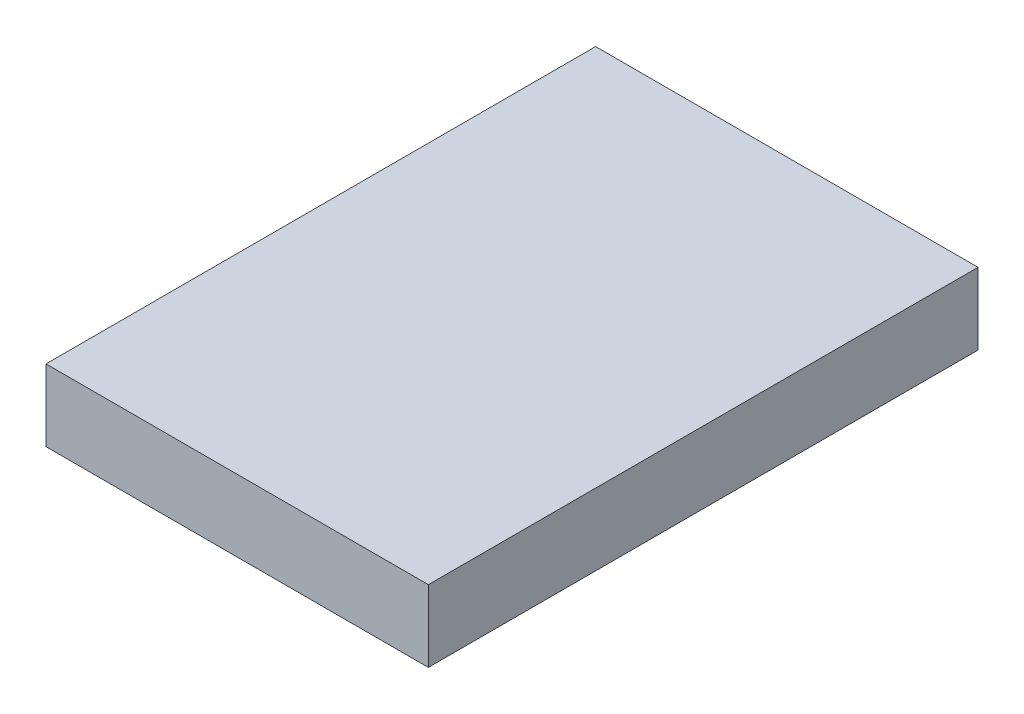
ISO-10303-21;
HEADER;
FILE_DESCRIPTION(('STEP AP214'),'2;1');
FILE_NAME('part.step','',(''),(''),'','','');
FILE_SCHEMA(('AUTOMOTIVE_DESIGN { 1 0 10303 214 1 1 1 1 }'));
ENDSEC;
DATA;
#1=APPLICATION_CONTEXT('core data for automotive mechanical design processes');
#2=APPLICATION_PROTOCOL_DEFINITION('international standard','automotive_design',2000,#1);
#3=PRODUCT_CONTEXT('',#1,'mechanical');
#4=PRODUCT('Part','Part','',(#3));
#5=PRODUCT_RELATED_PRODUCT_CATEGORY('part','',(#4));
#6=PRODUCT_DEFINITION_FORMATION('','',#4);
#7=PRODUCT_DEFINITION_CONTEXT('part definition',#1,'design');
#8=PRODUCT_DEFINITION('design','',#6,#7);
#9=PRODUCT_DEFINITION_SHAPE('','',#8);
#10=(LENGTH_UNIT() NAMED_UNIT(*) SI_UNIT(.MILLI.,.METRE.));
#11=(NAMED_UNIT(*) PLANE_ANGLE_UNIT() SI_UNIT($,.RADIAN.));
#12=(NAMED_UNIT(*) SI_UNIT($,.STERADIAN.) SOLID_ANGLE_UNIT());
#13=UNCERTAINTY_MEASURE_WITH_UNIT(LENGTH_MEASURE(1.E-05),#10,'distance_accuracy_value','');
#14=(GEOMETRIC_REPRESENTATION_CONTEXT(3) GLOBAL_UNCERTAINTY_ASSIGNED_CONTEXT((#13)) GLOBAL_UNIT_ASSIGNED_CONTEXT((#10,
#11,#12)) REPRESENTATION_CONTEXT('',''));
#15=CARTESIAN_POINT('',(0.,0.,0.));
#16=DIRECTION('',(0.,0.,1.));
#17=DIRECTION('',(1.,0.,0.));
#18=AXIS2_PLACEMENT_3D('',#15,#16,#17);
#19=CARTESIAN_POINT('',(0.,19.05,0.));
#20=DIRECTION('',(1.,0.,0.));
#21=DIRECTION('',(0.,0.,-1.));
#22=AXIS2_PLACEMENT_3D('',#19,#20,#21);
#23=PLANE('',#22);
#24=DIRECTION('',(0.,0.,1.));
#25=VECTOR('',#24,1.);
#26=CARTESIAN_POINT('',(0.,0.,0.));
#27=LINE('',#26,#25);
#28=CARTESIAN_POINT('',(0.,0.,-146.05));
#29=VERTEX_POINT('',#28);
#30=CARTESIAN_POINT('',(0.,0.,0.));
#31=VERTEX_POINT('',#30);
#32=EDGE_CURVE('E105',#29,#31,#27,.T.);
#33=ORIENTED_EDGE('',*,*,#32,.T.);
#34=DIRECTION('',(0.,-1.,0.));
#35=VECTOR('',#34,1.);
#36=CARTESIAN_POINT('',(0.,19.05,0.));
#37=LINE('',#36,#35);
#38=CARTESIAN_POINT('',(0.,19.05,0.));
#39=VERTEX_POINT('',#38);
#40=EDGE_CURVE('E11',#39,#31,#37,.T.);
#41=ORIENTED_EDGE('',*,*,#40,.F.);
#42=DIRECTION('',(0.,0.,1.));
#43=VECTOR('',#42,1.);
#44=CARTESIAN_POINT('',(0.,19.05,0.));
#45=LINE('',#44,#43);
#46=CARTESIAN_POINT('',(0.,19.05,-146.05));
#47=VERTEX_POINT('',#46);
#48=EDGE_CURVE('E89',#47,#39,#45,.T.);
#49=ORIENTED_EDGE('',*,*,#48,.F.);
#50=DIRECTION('',(0.,-1.,0.));
#51=VECTOR('',#50,1.);
#52=CARTESIAN_POINT('',(0.,19.05,-146.05));
#53=LINE('',#52,#51);
#54=EDGE_CURVE('E97',#47,#29,#53,.T.);
#55=ORIENTED_EDGE('',*,*,#54,.T.);
#56=EDGE_LOOP('',(#33,#41,#49,#55));
#57=FACE_BOUND('',#56,.T.);
#58=ADVANCED_FACE('F39',(#57),#23,.F.);
#59=CARTESIAN_POINT('',(0.,19.05,0.));
#60=DIRECTION('',(0.,0.,-1.));
#61=DIRECTION('',(-1.,0.,0.));
#62=AXIS2_PLACEMENT_3D('',#59,#60,#61);
#63=PLANE('',#62);
#64=DIRECTION('',(1.,0.,0.));
#65=VECTOR('',#64,1.);
#66=CARTESIAN_POINT('',(0.,0.,0.));
#67=LINE('',#66,#65);
#68=CARTESIAN_POINT('',(101.6,0.,0.));
#69=VERTEX_POINT('',#68);
#70=EDGE_CURVE('E92',#31,#69,#67,.T.);
#71=ORIENTED_EDGE('',*,*,#70,.T.);
#72=DIRECTION('',(0.,-1.,0.));
#73=VECTOR('',#72,1.);
#74=CARTESIAN_POINT('',(101.6,19.05,0.));
#75=LINE('',#74,#73);
#76=CARTESIAN_POINT('',(101.6,19.05,0.));
#77=VERTEX_POINT('',#76);
#78=EDGE_CURVE('E50',#77,#69,#75,.T.);
#79=ORIENTED_EDGE('',*,*,#78,.F.);
#80=DIRECTION('',(1.,0.,0.));
#81=VECTOR('',#80,1.);
#82=CARTESIAN_POINT('',(0.,19.05,0.));
#83=LINE('',#82,#81);
#84=EDGE_CURVE('E82',#39,#77,#83,.T.);
#85=ORIENTED_EDGE('',*,*,#84,.F.);
#86=ORIENTED_EDGE('',*,*,#40,.T.);
#87=EDGE_LOOP('',(#71,#79,#85,#86));
#88=FACE_BOUND('',#87,.T.);
#89=ADVANCED_FACE('F93',(#88),#63,.F.);
#90=CARTESIAN_POINT('',(101.6,19.05,0.));
#91=DIRECTION('',(-1.,0.,0.));
#92=DIRECTION('',(0.,0.,1.));
#93=AXIS2_PLACEMENT_3D('',#90,#91,#92);
#94=PLANE('',#93);
#95=DIRECTION('',(0.,0.,-1.));
#96=VECTOR('',#95,1.);
#97=CARTESIAN_POINT('',(101.6,0.,0.));
#98=LINE('',#97,#96);
#99=CARTESIAN_POINT('',(101.6,0.,-146.05));
#100=VERTEX_POINT('',#99);
#101=EDGE_CURVE('E72',#69,#100,#98,.T.);
#102=ORIENTED_EDGE('',*,*,#101,.T.);
#103=DIRECTION('',(0.,-1.,0.));
#104=VECTOR('',#103,1.);
#105=CARTESIAN_POINT('',(101.6,19.05,-146.05));
#106=LINE('',#105,#104);
#107=CARTESIAN_POINT('',(101.6,19.05,-146.05));
#108=VERTEX_POINT('',#107);
#109=EDGE_CURVE('E94',#108,#100,#106,.T.);
#110=ORIENTED_EDGE('',*,*,#109,.F.);
#111=DIRECTION('',(0.,0.,-1.));
#112=VECTOR('',#111,1.);
#113=CARTESIAN_POINT('',(101.6,19.05,0.));
#114=LINE('',#113,#112);
#115=EDGE_CURVE('E88',#77,#108,#114,.T.);
#116=ORIENTED_EDGE('',*,*,#115,.F.);
#117=ORIENTED_EDGE('',*,*,#78,.T.);
#118=EDGE_LOOP('',(#102,#110,#116,#117));
#119=FACE_BOUND('',#118,.T.);
#120=ADVANCED_FACE('F96',(#119),#94,.F.);
#121=CARTESIAN_POINT('',(0.,19.05,-146.05));
#122=DIRECTION('',(0.,0.,1.));
#123=DIRECTION('',(1.,0.,0.));
#124=AXIS2_PLACEMENT_3D('',#121,#122,#123);
#125=PLANE('',#124);
#126=DIRECTION('',(-1.,0.,0.));
#127=VECTOR('',#126,1.);
#128=CARTESIAN_POINT('',(0.,0.,-146.05));
#129=LINE('',#128,#127);
#130=EDGE_CURVE('E76',#100,#29,#129,.T.);
#131=ORIENTED_EDGE('',*,*,#130,.T.);
#132=ORIENTED_EDGE('',*,*,#54,.F.);
#133=DIRECTION('',(-1.,0.,0.));
#134=VECTOR('',#133,1.);
#135=CARTESIAN_POINT('',(0.,19.05,-146.05));
#136=LINE('',#135,#134);
#137=EDGE_CURVE('E54',#108,#47,#136,.T.);
#138=ORIENTED_EDGE('',*,*,#137,.F.);
#139=ORIENTED_EDGE('',*,*,#109,.T.);
#140=EDGE_LOOP('',(#131,#132,#138,#139));
#141=FACE_BOUND('',#140,.T.);
#142=ADVANCED_FACE('F108',(#141),#125,.F.);
#143=CARTESIAN_POINT('',(0.,19.05,0.));
#144=DIRECTION('',(0.,-1.,0.));
#145=DIRECTION('',(0.,0.,-1.));
#146=AXIS2_PLACEMENT_3D('',#143,#144,#145);
#147=PLANE('',#146);
#148=ORIENTED_EDGE('',*,*,#48,.T.);
#149=ORIENTED_EDGE('',*,*,#84,.T.);
#150=ORIENTED_EDGE('',*,*,#115,.T.);
#151=ORIENTED_EDGE('',*,*,#137,.T.);
#152=EDGE_LOOP('',(#148,#149,#150,#151));
#153=FACE_BOUND('',#152,.T.);
#154=ADVANCED_FACE('F86',(#153),#147,.F.);
#155=CARTESIAN_POINT('',(0.,0.,0.));
#156=DIRECTION('',(0.,-1.,0.));
#157=DIRECTION('',(0.,0.,-1.));
#158=AXIS2_PLACEMENT_3D('',#155,#156,#157);
#159=PLANE('',#158);
#160=ORIENTED_EDGE('',*,*,#32,.F.);
#161=ORIENTED_EDGE('',*,*,#130,.F.);
#162=ORIENTED_EDGE('',*,*,#101,.F.);
#163=ORIENTED_EDGE('',*,*,#70,.F.);
#164=EDGE_LOOP('',(#160,#161,#162,#163));
#165=FACE_BOUND('',#164,.T.);
#166=ADVANCED_FACE('F115',(#165),#159,.T.);
#167=CLOSED_SHELL('',(#58,#89,#120,#142,#154,#166));
#168=MANIFOLD_SOLID_BREP('B2',#167);
#169=ADVANCED_BREP_SHAPE_REPRESENTATION('',(#18,#168),#14);
#170=SHAPE_DEFINITION_REPRESENTATION(#9,#169);
ENDSEC;
END-ISO-10303-21;
